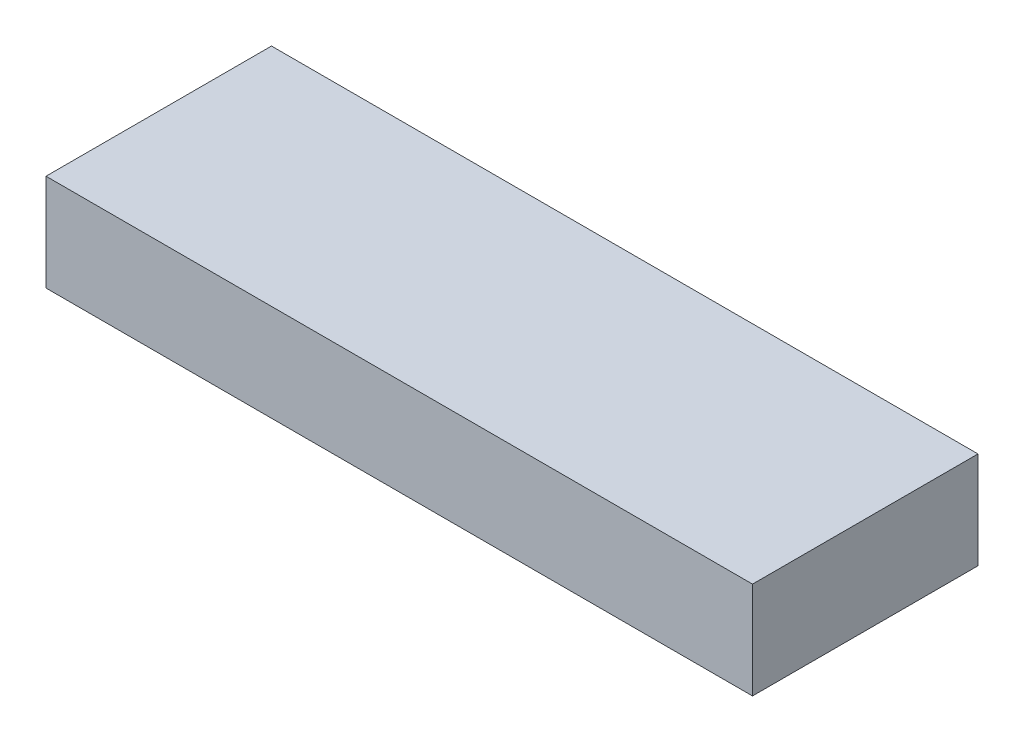
ISO-10303-21;
HEADER;
FILE_DESCRIPTION(('STEP AP214'),'2;1');
FILE_NAME('part.step','',(''),(''),'','','');
FILE_SCHEMA(('AUTOMOTIVE_DESIGN { 1 0 10303 214 1 1 1 1 }'));
ENDSEC;
DATA;
#1=APPLICATION_CONTEXT('core data for automotive mechanical design processes');
#2=APPLICATION_PROTOCOL_DEFINITION('international standard','automotive_design',2000,#1);
#3=PRODUCT_CONTEXT('',#1,'mechanical');
#4=PRODUCT('Part','Part','',(#3));
#5=PRODUCT_RELATED_PRODUCT_CATEGORY('part','',(#4));
#6=PRODUCT_DEFINITION_FORMATION('','',#4);
#7=PRODUCT_DEFINITION_CONTEXT('part definition',#1,'design');
#8=PRODUCT_DEFINITION('design','',#6,#7);
#9=PRODUCT_DEFINITION_SHAPE('','',#8);
#10=(LENGTH_UNIT() NAMED_UNIT(*) SI_UNIT(.MILLI.,.METRE.));
#11=(NAMED_UNIT(*) PLANE_ANGLE_UNIT() SI_UNIT($,.RADIAN.));
#12=(NAMED_UNIT(*) SI_UNIT($,.STERADIAN.) SOLID_ANGLE_UNIT());
#13=UNCERTAINTY_MEASURE_WITH_UNIT(LENGTH_MEASURE(1.E-05),#10,'distance_accuracy_value','');
#14=(GEOMETRIC_REPRESENTATION_CONTEXT(3) GLOBAL_UNCERTAINTY_ASSIGNED_CONTEXT((#13)) GLOBAL_UNIT_ASSIGNED_CONTEXT((#10,
#11,#12)) REPRESENTATION_CONTEXT('',''));
#15=CARTESIAN_POINT('',(0.,0.,0.));
#16=DIRECTION('',(0.,0.,1.));
#17=DIRECTION('',(1.,0.,0.));
#18=AXIS2_PLACEMENT_3D('',#15,#16,#17);
#19=CARTESIAN_POINT('',(0.,14.5796,0.));
#20=DIRECTION('',(1.,0.,0.));
#21=DIRECTION('',(0.,0.,-1.));
#22=AXIS2_PLACEMENT_3D('',#19,#20,#21);
#23=PLANE('',#22);
#24=DIRECTION('',(0.,0.,1.));
#25=VECTOR('',#24,1.);
#26=CARTESIAN_POINT('',(0.,0.,0.));
#27=LINE('',#26,#25);
#28=CARTESIAN_POINT('',(0.,0.,-33.9344));
#29=VERTEX_POINT('',#28);
#30=CARTESIAN_POINT('',(0.,0.,0.));
#31=VERTEX_POINT('',#30);
#32=EDGE_CURVE('E100',#29,#31,#27,.T.);
#33=ORIENTED_EDGE('',*,*,#32,.T.);
#34=DIRECTION('',(0.,-1.,0.));
#35=VECTOR('',#34,1.);
#36=CARTESIAN_POINT('',(0.,14.5796,0.));
#37=LINE('',#36,#35);
#38=CARTESIAN_POINT('',(0.,14.5796,0.));
#39=VERTEX_POINT('',#38);
#40=EDGE_CURVE('E11',#39,#31,#37,.T.);
#41=ORIENTED_EDGE('',*,*,#40,.F.);
#42=DIRECTION('',(0.,0.,1.));
#43=VECTOR('',#42,1.);
#44=CARTESIAN_POINT('',(0.,14.5796,0.));
#45=LINE('',#44,#43);
#46=CARTESIAN_POINT('',(0.,14.5796,-33.9344));
#47=VERTEX_POINT('',#46);
#48=EDGE_CURVE('E88',#47,#39,#45,.T.);
#49=ORIENTED_EDGE('',*,*,#48,.F.);
#50=DIRECTION('',(0.,-1.,0.));
#51=VECTOR('',#50,1.);
#52=CARTESIAN_POINT('',(0.,14.5796,-33.9344));
#53=LINE('',#52,#51);
#54=EDGE_CURVE('E96',#47,#29,#53,.T.);
#55=ORIENTED_EDGE('',*,*,#54,.T.);
#56=EDGE_LOOP('',(#33,#41,#49,#55));
#57=FACE_BOUND('',#56,.T.);
#58=ADVANCED_FACE('F37',(#57),#23,.F.);
#59=CARTESIAN_POINT('',(0.,14.5796,0.));
#60=DIRECTION('',(0.,0.,-1.));
#61=DIRECTION('',(-1.,0.,0.));
#62=AXIS2_PLACEMENT_3D('',#59,#60,#61);
#63=PLANE('',#62);
#64=DIRECTION('',(1.,0.,0.));
#65=VECTOR('',#64,1.);
#66=CARTESIAN_POINT('',(0.,0.,0.));
#67=LINE('',#66,#65);
#68=CARTESIAN_POINT('',(106.3244,0.,0.));
#69=VERTEX_POINT('',#68);
#70=EDGE_CURVE('E92',#31,#69,#67,.T.);
#71=ORIENTED_EDGE('',*,*,#70,.T.);
#72=DIRECTION('',(0.,-1.,0.));
#73=VECTOR('',#72,1.);
#74=CARTESIAN_POINT('',(106.3244,14.5796,0.));
#75=LINE('',#74,#73);
#76=CARTESIAN_POINT('',(106.3244,14.5796,0.));
#77=VERTEX_POINT('',#76);
#78=EDGE_CURVE('E45',#77,#69,#75,.T.);
#79=ORIENTED_EDGE('',*,*,#78,.F.);
#80=DIRECTION('',(1.,0.,0.));
#81=VECTOR('',#80,1.);
#82=CARTESIAN_POINT('',(0.,14.5796,0.));
#83=LINE('',#82,#81);
#84=EDGE_CURVE('E83',#39,#77,#83,.T.);
#85=ORIENTED_EDGE('',*,*,#84,.F.);
#86=ORIENTED_EDGE('',*,*,#40,.T.);
#87=EDGE_LOOP('',(#71,#79,#85,#86));
#88=FACE_BOUND('',#87,.T.);
#89=ADVANCED_FACE('F91',(#88),#63,.F.);
#90=CARTESIAN_POINT('',(106.3244,14.5796,0.));
#91=DIRECTION('',(-1.,0.,0.));
#92=DIRECTION('',(0.,0.,1.));
#93=AXIS2_PLACEMENT_3D('',#90,#91,#92);
#94=PLANE('',#93);
#95=DIRECTION('',(0.,0.,-1.));
#96=VECTOR('',#95,1.);
#97=CARTESIAN_POINT('',(106.3244,0.,0.));
#98=LINE('',#97,#96);
#99=CARTESIAN_POINT('',(106.3244,0.,-33.9344));
#100=VERTEX_POINT('',#99);
#101=EDGE_CURVE('E70',#69,#100,#98,.T.);
#102=ORIENTED_EDGE('',*,*,#101,.T.);
#103=DIRECTION('',(0.,-1.,0.));
#104=VECTOR('',#103,1.);
#105=CARTESIAN_POINT('',(106.3244,14.5796,-33.9344));
#106=LINE('',#105,#104);
#107=CARTESIAN_POINT('',(106.3244,14.5796,-33.9344));
#108=VERTEX_POINT('',#107);
#109=EDGE_CURVE('E93',#108,#100,#106,.T.);
#110=ORIENTED_EDGE('',*,*,#109,.F.);
#111=DIRECTION('',(0.,0.,-1.));
#112=VECTOR('',#111,1.);
#113=CARTESIAN_POINT('',(106.3244,14.5796,0.));
#114=LINE('',#113,#112);
#115=EDGE_CURVE('E86',#77,#108,#114,.T.);
#116=ORIENTED_EDGE('',*,*,#115,.F.);
#117=ORIENTED_EDGE('',*,*,#78,.T.);
#118=EDGE_LOOP('',(#102,#110,#116,#117));
#119=FACE_BOUND('',#118,.T.);
#120=ADVANCED_FACE('F94',(#119),#94,.F.);
#121=CARTESIAN_POINT('',(0.,14.5796,-33.9344));
#122=DIRECTION('',(0.,0.,1.));
#123=DIRECTION('',(1.,0.,0.));
#124=AXIS2_PLACEMENT_3D('',#121,#122,#123);
#125=PLANE('',#124);
#126=DIRECTION('',(-1.,0.,0.));
#127=VECTOR('',#126,1.);
#128=CARTESIAN_POINT('',(0.,0.,-33.9344));
#129=LINE('',#128,#127);
#130=EDGE_CURVE('E76',#100,#29,#129,.T.);
#131=ORIENTED_EDGE('',*,*,#130,.T.);
#132=ORIENTED_EDGE('',*,*,#54,.F.);
#133=DIRECTION('',(-1.,0.,0.));
#134=VECTOR('',#133,1.);
#135=CARTESIAN_POINT('',(0.,14.5796,-33.9344));
#136=LINE('',#135,#134);
#137=EDGE_CURVE('E53',#108,#47,#136,.T.);
#138=ORIENTED_EDGE('',*,*,#137,.F.);
#139=ORIENTED_EDGE('',*,*,#109,.T.);
#140=EDGE_LOOP('',(#131,#132,#138,#139));
#141=FACE_BOUND('',#140,.T.);
#142=ADVANCED_FACE('F107',(#141),#125,.F.);
#143=CARTESIAN_POINT('',(0.,14.5796,0.));
#144=DIRECTION('',(0.,-1.,0.));
#145=DIRECTION('',(0.,0.,-1.));
#146=AXIS2_PLACEMENT_3D('',#143,#144,#145);
#147=PLANE('',#146);
#148=ORIENTED_EDGE('',*,*,#48,.T.);
#149=ORIENTED_EDGE('',*,*,#84,.T.);
#150=ORIENTED_EDGE('',*,*,#115,.T.);
#151=ORIENTED_EDGE('',*,*,#137,.T.);
#152=EDGE_LOOP('',(#148,#149,#150,#151));
#153=FACE_BOUND('',#152,.T.);
#154=ADVANCED_FACE('F84',(#153),#147,.F.);
#155=CARTESIAN_POINT('',(0.,0.,0.));
#156=DIRECTION('',(0.,-1.,0.));
#157=DIRECTION('',(0.,0.,-1.));
#158=AXIS2_PLACEMENT_3D('',#155,#156,#157);
#159=PLANE('',#158);
#160=ORIENTED_EDGE('',*,*,#32,.F.);
#161=ORIENTED_EDGE('',*,*,#130,.F.);
#162=ORIENTED_EDGE('',*,*,#101,.F.);
#163=ORIENTED_EDGE('',*,*,#70,.F.);
#164=EDGE_LOOP('',(#160,#161,#162,#163));
#165=FACE_BOUND('',#164,.T.);
#166=ADVANCED_FACE('F110',(#165),#159,.T.);
#167=CLOSED_SHELL('',(#58,#89,#120,#142,#154,#166));
#168=MANIFOLD_SOLID_BREP('B2',#167);
#169=ADVANCED_BREP_SHAPE_REPRESENTATION('',(#18,#168),#14);
#170=SHAPE_DEFINITION_REPRESENTATION(#9,#169);
ENDSEC;
END-ISO-10303-21;
